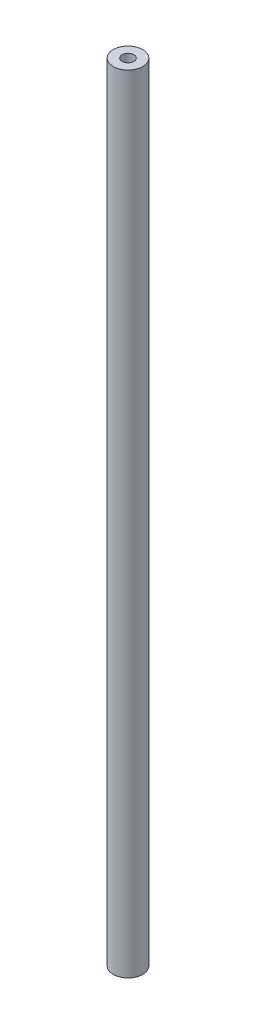
ISO-10303-21;
HEADER;
FILE_DESCRIPTION(('STEP AP214'),'2;1');
FILE_NAME('part.step','',(''),(''),'','','');
FILE_SCHEMA(('AUTOMOTIVE_DESIGN { 1 0 10303 214 1 1 1 1 }'));
ENDSEC;
DATA;
#1=APPLICATION_CONTEXT('core data for automotive mechanical design processes');
#2=APPLICATION_PROTOCOL_DEFINITION('international standard','automotive_design',2000,#1);
#3=PRODUCT_CONTEXT('',#1,'mechanical');
#4=PRODUCT('Part','Part','',(#3));
#5=PRODUCT_RELATED_PRODUCT_CATEGORY('part','',(#4));
#6=PRODUCT_DEFINITION_FORMATION('','',#4);
#7=PRODUCT_DEFINITION_CONTEXT('part definition',#1,'design');
#8=PRODUCT_DEFINITION('design','',#6,#7);
#9=PRODUCT_DEFINITION_SHAPE('','',#8);
#10=(LENGTH_UNIT() NAMED_UNIT(*) SI_UNIT(.MILLI.,.METRE.));
#11=(NAMED_UNIT(*) PLANE_ANGLE_UNIT() SI_UNIT($,.RADIAN.));
#12=(NAMED_UNIT(*) SI_UNIT($,.STERADIAN.) SOLID_ANGLE_UNIT());
#13=UNCERTAINTY_MEASURE_WITH_UNIT(LENGTH_MEASURE(1.E-05),#10,'distance_accuracy_value','');
#14=(GEOMETRIC_REPRESENTATION_CONTEXT(3) GLOBAL_UNCERTAINTY_ASSIGNED_CONTEXT((#13)) GLOBAL_UNIT_ASSIGNED_CONTEXT((#10,
#11,#12)) REPRESENTATION_CONTEXT('',''));
#15=CARTESIAN_POINT('',(0.,0.,0.));
#16=DIRECTION('',(0.,0.,1.));
#17=DIRECTION('',(1.,0.,0.));
#18=AXIS2_PLACEMENT_3D('',#15,#16,#17);
#19=CARTESIAN_POINT('',(0.,254.,0.));
#20=DIRECTION('',(0.,-1.,0.));
#21=DIRECTION('',(0.,0.,-1.));
#22=AXIS2_PLACEMENT_3D('',#19,#20,#21);
#23=CYLINDRICAL_SURFACE('',#22,4.7625);
#24=CARTESIAN_POINT('',(0.,254.,0.));
#25=DIRECTION('',(0.,1.,0.));
#26=DIRECTION('',(0.,0.,1.));
#27=AXIS2_PLACEMENT_3D('',#24,#25,#26);
#28=CIRCLE('',#27,4.7625);
#29=CARTESIAN_POINT('',(0.,254.,4.7625));
#30=VERTEX_POINT('',#29);
#31=EDGE_CURVE('E11',#30,#30,#28,.T.);
#32=ORIENTED_EDGE('',*,*,#31,.F.);
#33=EDGE_LOOP('',(#32));
#34=FACE_BOUND('',#33,.T.);
#35=CARTESIAN_POINT('',(0.,0.,0.));
#36=DIRECTION('',(0.,1.,0.));
#37=DIRECTION('',(0.,0.,1.));
#38=AXIS2_PLACEMENT_3D('',#35,#36,#37);
#39=CIRCLE('',#38,4.7625);
#40=CARTESIAN_POINT('',(0.,0.,4.7625));
#41=VERTEX_POINT('',#40);
#42=EDGE_CURVE('E40',#41,#41,#39,.T.);
#43=ORIENTED_EDGE('',*,*,#42,.T.);
#44=EDGE_LOOP('',(#43));
#45=FACE_BOUND('',#44,.T.);
#46=ADVANCED_FACE('F37',(#34,#45),#23,.T.);
#47=CARTESIAN_POINT('',(0.,254.,0.));
#48=DIRECTION('',(0.,1.,0.));
#49=DIRECTION('',(0.,0.,1.));
#50=AXIS2_PLACEMENT_3D('',#47,#48,#49);
#51=PLANE('',#50);
#52=CARTESIAN_POINT('',(0.,254.,0.));
#53=DIRECTION('',(0.,1.,0.));
#54=DIRECTION('',(0.,0.,1.));
#55=AXIS2_PLACEMENT_3D('',#52,#53,#54);
#56=CIRCLE('',#55,1.89865);
#57=CARTESIAN_POINT('',(0.,254.,1.89865));
#58=VERTEX_POINT('',#57);
#59=EDGE_CURVE('E61',#58,#58,#56,.T.);
#60=ORIENTED_EDGE('',*,*,#59,.F.);
#61=EDGE_LOOP('',(#60));
#62=FACE_BOUND('',#61,.T.);
#63=ORIENTED_EDGE('',*,*,#31,.T.);
#64=EDGE_LOOP('',(#63));
#65=FACE_BOUND('',#64,.T.);
#66=ADVANCED_FACE('F79',(#62,#65),#51,.T.);
#67=CARTESIAN_POINT('',(0.,0.,0.));
#68=DIRECTION('',(0.,1.,0.));
#69=DIRECTION('',(0.,0.,1.));
#70=AXIS2_PLACEMENT_3D('',#67,#68,#69);
#71=PLANE('',#70);
#72=CARTESIAN_POINT('',(0.,0.,0.));
#73=DIRECTION('',(0.,-1.,0.));
#74=DIRECTION('',(0.,0.,-1.));
#75=AXIS2_PLACEMENT_3D('',#72,#73,#74);
#76=CIRCLE('',#75,1.89865);
#77=CARTESIAN_POINT('',(0.,0.,-1.89865));
#78=VERTEX_POINT('',#77);
#79=EDGE_CURVE('E60',#78,#78,#76,.T.);
#80=ORIENTED_EDGE('',*,*,#79,.F.);
#81=EDGE_LOOP('',(#80));
#82=FACE_BOUND('',#81,.T.);
#83=ORIENTED_EDGE('',*,*,#42,.F.);
#84=EDGE_LOOP('',(#83));
#85=FACE_BOUND('',#84,.T.);
#86=ADVANCED_FACE('F76',(#82,#85),#71,.F.);
#87=CARTESIAN_POINT('',(0.,12.83,0.));
#88=DIRECTION('',(0.,-1.,0.));
#89=DIRECTION('',(0.,0.,-1.));
#90=AXIS2_PLACEMENT_3D('',#87,#88,#89);
#91=CONICAL_SURFACE('',#90,1.89865,1.02974425867665);
#92=CARTESIAN_POINT('',(0.,13.9708240143167,0.));
#93=VERTEX_POINT('',#92);
#94=VERTEX_LOOP('',#93);
#95=FACE_BOUND('',#94,.T.);
#96=CARTESIAN_POINT('',(0.,12.83,0.));
#97=DIRECTION('',(0.,-1.,0.));
#98=DIRECTION('',(0.,0.,-1.));
#99=AXIS2_PLACEMENT_3D('',#96,#97,#98);
#100=CIRCLE('',#99,1.89865);
#101=CARTESIAN_POINT('',(0.,12.83,-1.89865));
#102=VERTEX_POINT('',#101);
#103=EDGE_CURVE('E64',#102,#102,#100,.T.);
#104=ORIENTED_EDGE('',*,*,#103,.T.);
#105=EDGE_LOOP('',(#104));
#106=FACE_BOUND('',#105,.T.);
#107=ADVANCED_FACE('F78',(#95,#106),#91,.F.);
#108=CARTESIAN_POINT('',(0.,0.,0.));
#109=DIRECTION('',(0.,-1.,0.));
#110=DIRECTION('',(0.,0.,-1.));
#111=AXIS2_PLACEMENT_3D('',#108,#109,#110);
#112=CYLINDRICAL_SURFACE('',#111,1.89865);
#113=ORIENTED_EDGE('',*,*,#103,.F.);
#114=EDGE_LOOP('',(#113));
#115=FACE_BOUND('',#114,.T.);
#116=ORIENTED_EDGE('',*,*,#79,.T.);
#117=EDGE_LOOP('',(#116));
#118=FACE_BOUND('',#117,.T.);
#119=ADVANCED_FACE('F54',(#115,#118),#112,.F.);
#120=CARTESIAN_POINT('',(0.,241.17,0.));
#121=DIRECTION('',(0.,1.,0.));
#122=DIRECTION('',(0.,0.,1.));
#123=AXIS2_PLACEMENT_3D('',#120,#121,#122);
#124=CONICAL_SURFACE('',#123,1.89865,1.02974425867666);
#125=CARTESIAN_POINT('',(0.,240.029175985683,0.));
#126=VERTEX_POINT('',#125);
#127=VERTEX_LOOP('',#126);
#128=FACE_BOUND('',#127,.T.);
#129=CARTESIAN_POINT('',(0.,241.17,0.));
#130=DIRECTION('',(0.,1.,0.));
#131=DIRECTION('',(0.,0.,1.));
#132=AXIS2_PLACEMENT_3D('',#129,#130,#131);
#133=CIRCLE('',#132,1.89865);
#134=CARTESIAN_POINT('',(0.,241.17,1.89865));
#135=VERTEX_POINT('',#134);
#136=EDGE_CURVE('E58',#135,#135,#133,.T.);
#137=ORIENTED_EDGE('',*,*,#136,.T.);
#138=EDGE_LOOP('',(#137));
#139=FACE_BOUND('',#138,.T.);
#140=ADVANCED_FACE('F50',(#128,#139),#124,.F.);
#141=CARTESIAN_POINT('',(0.,254.,0.));
#142=DIRECTION('',(0.,1.,0.));
#143=DIRECTION('',(0.,0.,1.));
#144=AXIS2_PLACEMENT_3D('',#141,#142,#143);
#145=CYLINDRICAL_SURFACE('',#144,1.89865);
#146=ORIENTED_EDGE('',*,*,#136,.F.);
#147=EDGE_LOOP('',(#146));
#148=FACE_BOUND('',#147,.T.);
#149=ORIENTED_EDGE('',*,*,#59,.T.);
#150=EDGE_LOOP('',(#149));
#151=FACE_BOUND('',#150,.T.);
#152=ADVANCED_FACE('F53',(#148,#151),#145,.F.);
#153=CLOSED_SHELL('',(#46,#66,#86,#107,#119,#140,#152));
#154=MANIFOLD_SOLID_BREP('B2',#153);
#155=ADVANCED_BREP_SHAPE_REPRESENTATION('',(#18,#154),#14);
#156=SHAPE_DEFINITION_REPRESENTATION(#9,#155);
ENDSEC;
END-ISO-10303-21;
